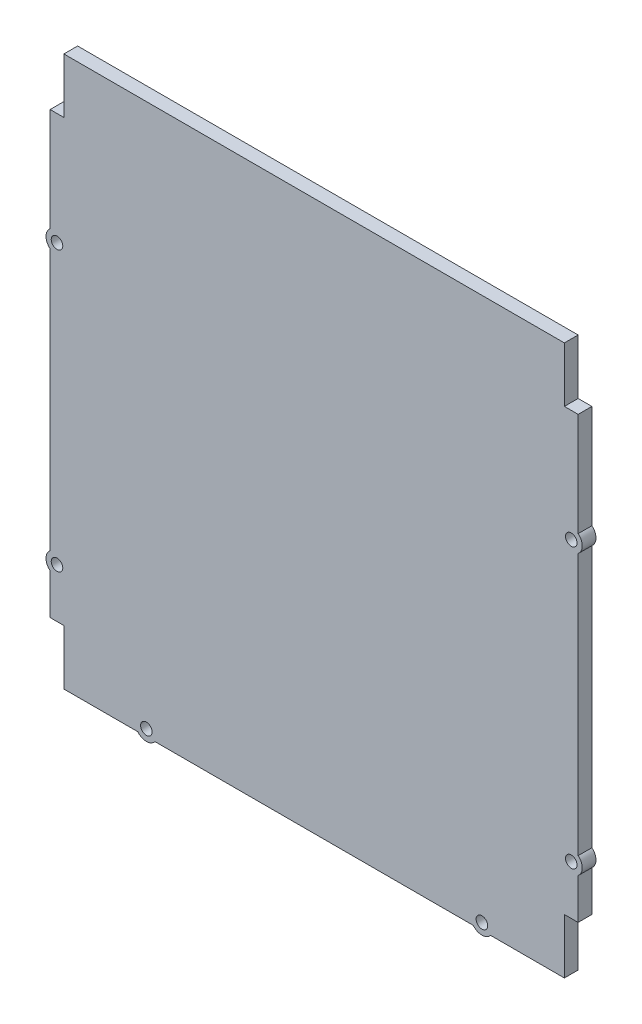
ISO-10303-21;
HEADER;
FILE_DESCRIPTION(('STEP AP214'),'2;1');
FILE_NAME('part.step','',(''),(''),'','','');
FILE_SCHEMA(('AUTOMOTIVE_DESIGN { 1 0 10303 214 1 1 1 1 }'));
ENDSEC;
DATA;
#1=APPLICATION_CONTEXT('core data for automotive mechanical design processes');
#2=APPLICATION_PROTOCOL_DEFINITION('international standard','automotive_design',2000,#1);
#3=PRODUCT_CONTEXT('',#1,'mechanical');
#4=PRODUCT('Part','Part','',(#3));
#5=PRODUCT_RELATED_PRODUCT_CATEGORY('part','',(#4));
#6=PRODUCT_DEFINITION_FORMATION('','',#4);
#7=PRODUCT_DEFINITION_CONTEXT('part definition',#1,'design');
#8=PRODUCT_DEFINITION('design','',#6,#7);
#9=PRODUCT_DEFINITION_SHAPE('','',#8);
#10=(LENGTH_UNIT() NAMED_UNIT(*) SI_UNIT(.MILLI.,.METRE.));
#11=(NAMED_UNIT(*) PLANE_ANGLE_UNIT() SI_UNIT($,.RADIAN.));
#12=(NAMED_UNIT(*) SI_UNIT($,.STERADIAN.) SOLID_ANGLE_UNIT());
#13=UNCERTAINTY_MEASURE_WITH_UNIT(LENGTH_MEASURE(1.E-05),#10,'distance_accuracy_value','');
#14=(GEOMETRIC_REPRESENTATION_CONTEXT(3) GLOBAL_UNCERTAINTY_ASSIGNED_CONTEXT((#13)) GLOBAL_UNIT_ASSIGNED_CONTEXT((#10,
#11,#12)) REPRESENTATION_CONTEXT('',''));
#15=CARTESIAN_POINT('',(0.,0.,0.));
#16=DIRECTION('',(0.,0.,1.));
#17=DIRECTION('',(1.,0.,0.));
#18=AXIS2_PLACEMENT_3D('',#15,#16,#17);
#19=CARTESIAN_POINT('',(-182.,0.,5.));
#20=DIRECTION('',(0.,1.,0.));
#21=DIRECTION('',(0.,0.,1.));
#22=AXIS2_PLACEMENT_3D('',#19,#20,#21);
#23=PLANE('',#22);
#24=DIRECTION('',(1.,0.,0.));
#25=VECTOR('',#24,1.);
#26=CARTESIAN_POINT('',(-182.,0.,5.));
#27=LINE('',#26,#25);
#28=CARTESIAN_POINT('',(-26.8775010008008,0.,5.));
#29=VERTEX_POINT('',#28);
#30=CARTESIAN_POINT('',(0.,0.,5.));
#31=VERTEX_POINT('',#30);
#32=EDGE_CURVE('E52',#29,#31,#27,.T.);
#33=ORIENTED_EDGE('',*,*,#32,.F.);
#34=DIRECTION('',(0.,0.,-1.));
#35=VECTOR('',#34,1.);
#36=CARTESIAN_POINT('',(-26.8775010008008,0.,5.));
#37=LINE('',#36,#35);
#38=CARTESIAN_POINT('',(-26.8775010008008,0.,0.));
#39=VERTEX_POINT('',#38);
#40=EDGE_CURVE('E211',#29,#39,#37,.T.);
#41=ORIENTED_EDGE('',*,*,#40,.T.);
#42=DIRECTION('',(1.,0.,0.));
#43=VECTOR('',#42,1.);
#44=CARTESIAN_POINT('',(-182.,0.,0.));
#45=LINE('',#44,#43);
#46=CARTESIAN_POINT('',(0.,0.,0.));
#47=VERTEX_POINT('',#46);
#48=EDGE_CURVE('E199',#39,#47,#45,.T.);
#49=ORIENTED_EDGE('',*,*,#48,.T.);
#50=DIRECTION('',(0.,0.,-1.));
#51=VECTOR('',#50,1.);
#52=CARTESIAN_POINT('',(0.,0.,5.));
#53=LINE('',#52,#51);
#54=EDGE_CURVE('E391',#31,#47,#53,.T.);
#55=ORIENTED_EDGE('',*,*,#54,.F.);
#56=EDGE_LOOP('',(#33,#41,#49,#55));
#57=FACE_BOUND('',#56,.T.);
#58=ADVANCED_FACE('F37',(#57),#23,.F.);
#59=CARTESIAN_POINT('',(-148.877501000801,0.,0.));
#60=VERTEX_POINT('',#59);
#61=CARTESIAN_POINT('',(-33.1224989991992,0.,0.));
#62=VERTEX_POINT('',#61);
#63=EDGE_CURVE('E207',#60,#62,#45,.T.);
#64=ORIENTED_EDGE('',*,*,#63,.T.);
#65=DIRECTION('',(0.,0.,-1.));
#66=VECTOR('',#65,1.);
#67=CARTESIAN_POINT('',(-33.1224989991992,0.,5.));
#68=LINE('',#67,#66);
#69=CARTESIAN_POINT('',(-33.1224989991992,0.,5.));
#70=VERTEX_POINT('',#69);
#71=EDGE_CURVE('E60',#70,#62,#68,.T.);
#72=ORIENTED_EDGE('',*,*,#71,.F.);
#73=CARTESIAN_POINT('',(-148.877501000801,0.,5.));
#74=VERTEX_POINT('',#73);
#75=EDGE_CURVE('E340',#74,#70,#27,.T.);
#76=ORIENTED_EDGE('',*,*,#75,.F.);
#77=DIRECTION('',(0.,0.,-1.));
#78=VECTOR('',#77,1.);
#79=CARTESIAN_POINT('',(-148.877501000801,0.,5.));
#80=LINE('',#79,#78);
#81=EDGE_CURVE('E229',#74,#60,#80,.T.);
#82=ORIENTED_EDGE('',*,*,#81,.T.);
#83=EDGE_LOOP('',(#64,#72,#76,#82));
#84=FACE_BOUND('',#83,.T.);
#85=ADVANCED_FACE('F469',(#84),#23,.F.);
#86=CARTESIAN_POINT('',(-187.,180.,5.));
#87=DIRECTION('',(1.,0.,0.));
#88=DIRECTION('',(0.,1.,0.));
#89=AXIS2_PLACEMENT_3D('',#86,#87,#88);
#90=PLANE('',#89);
#91=DIRECTION('',(0.,0.,-1.));
#92=VECTOR('',#91,1.);
#93=CARTESIAN_POINT('',(-187.,34.7775010008008,5.));
#94=LINE('',#93,#92);
#95=CARTESIAN_POINT('',(-187.,34.7775010008008,5.));
#96=VERTEX_POINT('',#95);
#97=CARTESIAN_POINT('',(-187.,34.7775010008008,0.));
#98=VERTEX_POINT('',#97);
#99=EDGE_CURVE('E253',#96,#98,#94,.T.);
#100=ORIENTED_EDGE('',*,*,#99,.T.);
#101=DIRECTION('',(0.,-1.,0.));
#102=VECTOR('',#101,1.);
#103=CARTESIAN_POINT('',(-187.,180.,0.));
#104=LINE('',#103,#102);
#105=CARTESIAN_POINT('',(-187.,20.,0.));
#106=VERTEX_POINT('',#105);
#107=EDGE_CURVE('E360',#98,#106,#104,.T.);
#108=ORIENTED_EDGE('',*,*,#107,.T.);
#109=DIRECTION('',(0.,0.,-1.));
#110=VECTOR('',#109,1.);
#111=CARTESIAN_POINT('',(-187.,20.,5.));
#112=LINE('',#111,#110);
#113=CARTESIAN_POINT('',(-187.,20.,5.));
#114=VERTEX_POINT('',#113);
#115=EDGE_CURVE('E399',#114,#106,#112,.T.);
#116=ORIENTED_EDGE('',*,*,#115,.F.);
#117=DIRECTION('',(0.,-1.,0.));
#118=VECTOR('',#117,1.);
#119=CARTESIAN_POINT('',(-187.,180.,5.));
#120=LINE('',#119,#118);
#121=EDGE_CURVE('E327',#96,#114,#120,.T.);
#122=ORIENTED_EDGE('',*,*,#121,.F.);
#123=EDGE_LOOP('',(#100,#108,#116,#122));
#124=FACE_BOUND('',#123,.T.);
#125=ADVANCED_FACE('F491',(#124),#90,.F.);
#126=DIRECTION('',(0.,0.,-1.));
#127=VECTOR('',#126,1.);
#128=CARTESIAN_POINT('',(-187.,41.0224989991992,5.));
#129=LINE('',#128,#127);
#130=CARTESIAN_POINT('',(-187.,41.0224989991992,5.));
#131=VERTEX_POINT('',#130);
#132=CARTESIAN_POINT('',(-187.,41.0224989991992,0.));
#133=VERTEX_POINT('',#132);
#134=EDGE_CURVE('E250',#131,#133,#129,.T.);
#135=ORIENTED_EDGE('',*,*,#134,.F.);
#136=CARTESIAN_POINT('',(-187.,136.177501000801,5.));
#137=VERTEX_POINT('',#136);
#138=EDGE_CURVE('E332',#137,#131,#120,.T.);
#139=ORIENTED_EDGE('',*,*,#138,.F.);
#140=DIRECTION('',(0.,0.,-1.));
#141=VECTOR('',#140,1.);
#142=CARTESIAN_POINT('',(-187.,136.177501000801,5.));
#143=LINE('',#142,#141);
#144=CARTESIAN_POINT('',(-187.,136.177501000801,0.));
#145=VERTEX_POINT('',#144);
#146=EDGE_CURVE('E265',#137,#145,#143,.T.);
#147=ORIENTED_EDGE('',*,*,#146,.T.);
#148=EDGE_CURVE('E364',#145,#133,#104,.T.);
#149=ORIENTED_EDGE('',*,*,#148,.T.);
#150=EDGE_LOOP('',(#135,#139,#147,#149));
#151=FACE_BOUND('',#150,.T.);
#152=ADVANCED_FACE('F495',(#151),#90,.F.);
#153=DIRECTION('',(0.,0.,-1.));
#154=VECTOR('',#153,1.);
#155=CARTESIAN_POINT('',(-187.,142.422498999199,5.));
#156=LINE('',#155,#154);
#157=CARTESIAN_POINT('',(-187.,142.422498999199,5.));
#158=VERTEX_POINT('',#157);
#159=CARTESIAN_POINT('',(-187.,142.422498999199,0.));
#160=VERTEX_POINT('',#159);
#161=EDGE_CURVE('E262',#158,#160,#156,.T.);
#162=ORIENTED_EDGE('',*,*,#161,.F.);
#163=CARTESIAN_POINT('',(-187.,180.,5.));
#164=VERTEX_POINT('',#163);
#165=EDGE_CURVE('E328',#164,#158,#120,.T.);
#166=ORIENTED_EDGE('',*,*,#165,.F.);
#167=DIRECTION('',(0.,0.,-1.));
#168=VECTOR('',#167,1.);
#169=CARTESIAN_POINT('',(-187.,180.,5.));
#170=LINE('',#169,#168);
#171=CARTESIAN_POINT('',(-187.,180.,0.));
#172=VERTEX_POINT('',#171);
#173=EDGE_CURVE('E402',#164,#172,#170,.T.);
#174=ORIENTED_EDGE('',*,*,#173,.T.);
#175=EDGE_CURVE('E361',#172,#160,#104,.T.);
#176=ORIENTED_EDGE('',*,*,#175,.T.);
#177=EDGE_LOOP('',(#162,#166,#174,#176));
#178=FACE_BOUND('',#177,.T.);
#179=ADVANCED_FACE('F415',(#178),#90,.F.);
#180=CARTESIAN_POINT('',(5.,20.,5.));
#181=DIRECTION('',(-1.,0.,0.));
#182=DIRECTION('',(0.,-1.,0.));
#183=AXIS2_PLACEMENT_3D('',#180,#181,#182);
#184=PLANE('',#183);
#185=DIRECTION('',(0.,1.,0.));
#186=VECTOR('',#185,1.);
#187=CARTESIAN_POINT('',(5.,20.,5.));
#188=LINE('',#187,#186);
#189=CARTESIAN_POINT('',(5.,41.0224989991992,5.));
#190=VERTEX_POINT('',#189);
#191=CARTESIAN_POINT('',(4.99999999999999,136.177501000801,5.));
#192=VERTEX_POINT('',#191);
#193=EDGE_CURVE('E349',#190,#192,#188,.T.);
#194=ORIENTED_EDGE('',*,*,#193,.F.);
#195=DIRECTION('',(0.,0.,-1.));
#196=VECTOR('',#195,1.);
#197=CARTESIAN_POINT('',(5.,41.0224989991992,5.));
#198=LINE('',#197,#196);
#199=CARTESIAN_POINT('',(5.,41.0224989991992,0.));
#200=VERTEX_POINT('',#199);
#201=EDGE_CURVE('E277',#190,#200,#198,.T.);
#202=ORIENTED_EDGE('',*,*,#201,.T.);
#203=DIRECTION('',(0.,1.,0.));
#204=VECTOR('',#203,1.);
#205=CARTESIAN_POINT('',(5.,20.,0.));
#206=LINE('',#205,#204);
#207=CARTESIAN_POINT('',(4.99999999999999,136.177501000801,0.));
#208=VERTEX_POINT('',#207);
#209=EDGE_CURVE('E374',#200,#208,#206,.T.);
#210=ORIENTED_EDGE('',*,*,#209,.T.);
#211=DIRECTION('',(0.,0.,-1.));
#212=VECTOR('',#211,1.);
#213=CARTESIAN_POINT('',(4.99999999999999,136.177501000801,5.));
#214=LINE('',#213,#212);
#215=EDGE_CURVE('E286',#192,#208,#214,.T.);
#216=ORIENTED_EDGE('',*,*,#215,.F.);
#217=EDGE_LOOP('',(#194,#202,#210,#216));
#218=FACE_BOUND('',#217,.T.);
#219=ADVANCED_FACE('F446',(#218),#184,.F.);
#220=CARTESIAN_POINT('',(4.99999999999999,142.422498999199,5.));
#221=VERTEX_POINT('',#220);
#222=CARTESIAN_POINT('',(4.99999999999999,180.,5.));
#223=VERTEX_POINT('',#222);
#224=EDGE_CURVE('E344',#221,#223,#188,.T.);
#225=ORIENTED_EDGE('',*,*,#224,.F.);
#226=DIRECTION('',(0.,0.,-1.));
#227=VECTOR('',#226,1.);
#228=CARTESIAN_POINT('',(4.99999999999999,142.422498999199,5.));
#229=LINE('',#228,#227);
#230=CARTESIAN_POINT('',(4.99999999999999,142.422498999199,0.));
#231=VERTEX_POINT('',#230);
#232=EDGE_CURVE('E289',#221,#231,#229,.T.);
#233=ORIENTED_EDGE('',*,*,#232,.T.);
#234=CARTESIAN_POINT('',(4.99999999999999,180.,0.));
#235=VERTEX_POINT('',#234);
#236=EDGE_CURVE('E370',#231,#235,#206,.T.);
#237=ORIENTED_EDGE('',*,*,#236,.T.);
#238=DIRECTION('',(0.,0.,-1.));
#239=VECTOR('',#238,1.);
#240=CARTESIAN_POINT('',(4.99999999999999,180.,5.));
#241=LINE('',#240,#239);
#242=EDGE_CURVE('E382',#223,#235,#241,.T.);
#243=ORIENTED_EDGE('',*,*,#242,.F.);
#244=EDGE_LOOP('',(#225,#233,#237,#243));
#245=FACE_BOUND('',#244,.T.);
#246=ADVANCED_FACE('F441',(#245),#184,.F.);
#247=CARTESIAN_POINT('',(0.,200.,5.));
#248=DIRECTION('',(0.,-1.,0.));
#249=DIRECTION('',(1.,0.,0.));
#250=AXIS2_PLACEMENT_3D('',#247,#248,#249);
#251=PLANE('',#250);
#252=DIRECTION('',(-1.,0.,0.));
#253=VECTOR('',#252,1.);
#254=CARTESIAN_POINT('',(0.,200.,0.));
#255=LINE('',#254,#253);
#256=CARTESIAN_POINT('',(0.,200.,0.));
#257=VERTEX_POINT('',#256);
#258=CARTESIAN_POINT('',(-182.,200.,0.));
#259=VERTEX_POINT('',#258);
#260=EDGE_CURVE('E318',#257,#259,#255,.T.);
#261=ORIENTED_EDGE('',*,*,#260,.T.);
#262=DIRECTION('',(0.,0.,-1.));
#263=VECTOR('',#262,1.);
#264=CARTESIAN_POINT('',(-182.,200.,5.));
#265=LINE('',#264,#263);
#266=CARTESIAN_POINT('',(-182.,200.,5.));
#267=VERTEX_POINT('',#266);
#268=EDGE_CURVE('E11',#267,#259,#265,.T.);
#269=ORIENTED_EDGE('',*,*,#268,.F.);
#270=DIRECTION('',(-1.,0.,0.));
#271=VECTOR('',#270,1.);
#272=CARTESIAN_POINT('',(0.,200.,5.));
#273=LINE('',#272,#271);
#274=CARTESIAN_POINT('',(0.,200.,5.));
#275=VERTEX_POINT('',#274);
#276=EDGE_CURVE('E319',#275,#267,#273,.T.);
#277=ORIENTED_EDGE('',*,*,#276,.F.);
#278=DIRECTION('',(0.,0.,-1.));
#279=VECTOR('',#278,1.);
#280=CARTESIAN_POINT('',(0.,200.,5.));
#281=LINE('',#280,#279);
#282=EDGE_CURVE('E353',#275,#257,#281,.T.);
#283=ORIENTED_EDGE('',*,*,#282,.T.);
#284=EDGE_LOOP('',(#261,#269,#277,#283));
#285=FACE_BOUND('',#284,.T.);
#286=ADVANCED_FACE('F39',(#285),#251,.F.);
#287=CARTESIAN_POINT('',(-182.,200.,5.));
#288=DIRECTION('',(1.,0.,0.));
#289=DIRECTION('',(0.,0.,-1.));
#290=AXIS2_PLACEMENT_3D('',#287,#288,#289);
#291=PLANE('',#290);
#292=DIRECTION('',(0.,-1.,0.));
#293=VECTOR('',#292,1.);
#294=CARTESIAN_POINT('',(-182.,200.,0.));
#295=LINE('',#294,#293);
#296=CARTESIAN_POINT('',(-182.,180.,0.));
#297=VERTEX_POINT('',#296);
#298=EDGE_CURVE('E356',#259,#297,#295,.T.);
#299=ORIENTED_EDGE('',*,*,#298,.T.);
#300=DIRECTION('',(0.,0.,-1.));
#301=VECTOR('',#300,1.);
#302=CARTESIAN_POINT('',(-182.,180.,5.));
#303=LINE('',#302,#301);
#304=CARTESIAN_POINT('',(-182.,180.,5.));
#305=VERTEX_POINT('',#304);
#306=EDGE_CURVE('E45',#305,#297,#303,.T.);
#307=ORIENTED_EDGE('',*,*,#306,.F.);
#308=DIRECTION('',(0.,-1.,0.));
#309=VECTOR('',#308,1.);
#310=CARTESIAN_POINT('',(-182.,200.,5.));
#311=LINE('',#310,#309);
#312=EDGE_CURVE('E322',#267,#305,#311,.T.);
#313=ORIENTED_EDGE('',*,*,#312,.F.);
#314=ORIENTED_EDGE('',*,*,#268,.T.);
#315=EDGE_LOOP('',(#299,#307,#313,#314));
#316=FACE_BOUND('',#315,.T.);
#317=ADVANCED_FACE('F427',(#316),#291,.F.);
#318=CARTESIAN_POINT('',(-182.,180.,5.));
#319=DIRECTION('',(0.,-1.,0.));
#320=DIRECTION('',(0.,0.,-1.));
#321=AXIS2_PLACEMENT_3D('',#318,#319,#320);
#322=PLANE('',#321);
#323=DIRECTION('',(-1.,0.,0.));
#324=VECTOR('',#323,1.);
#325=CARTESIAN_POINT('',(-182.,180.,0.));
#326=LINE('',#325,#324);
#327=EDGE_CURVE('E358',#297,#172,#326,.T.);
#328=ORIENTED_EDGE('',*,*,#327,.T.);
#329=ORIENTED_EDGE('',*,*,#173,.F.);
#330=DIRECTION('',(-1.,0.,0.));
#331=VECTOR('',#330,1.);
#332=CARTESIAN_POINT('',(-182.,180.,5.));
#333=LINE('',#332,#331);
#334=EDGE_CURVE('E325',#305,#164,#333,.T.);
#335=ORIENTED_EDGE('',*,*,#334,.F.);
#336=ORIENTED_EDGE('',*,*,#306,.T.);
#337=EDGE_LOOP('',(#328,#329,#335,#336));
#338=FACE_BOUND('',#337,.T.);
#339=ADVANCED_FACE('F409',(#338),#322,.F.);
#340=CARTESIAN_POINT('',(-187.,20.,5.));
#341=DIRECTION('',(0.,1.,0.));
#342=DIRECTION('',(0.,0.,1.));
#343=AXIS2_PLACEMENT_3D('',#340,#341,#342);
#344=PLANE('',#343);
#345=DIRECTION('',(1.,0.,0.));
#346=VECTOR('',#345,1.);
#347=CARTESIAN_POINT('',(-187.,20.,0.));
#348=LINE('',#347,#346);
#349=CARTESIAN_POINT('',(-182.,20.,0.));
#350=VERTEX_POINT('',#349);
#351=EDGE_CURVE('E363',#106,#350,#348,.T.);
#352=ORIENTED_EDGE('',*,*,#351,.T.);
#353=DIRECTION('',(0.,0.,-1.));
#354=VECTOR('',#353,1.);
#355=CARTESIAN_POINT('',(-182.,20.,5.));
#356=LINE('',#355,#354);
#357=CARTESIAN_POINT('',(-182.,20.,5.));
#358=VERTEX_POINT('',#357);
#359=EDGE_CURVE('E396',#358,#350,#356,.T.);
#360=ORIENTED_EDGE('',*,*,#359,.F.);
#361=DIRECTION('',(1.,0.,0.));
#362=VECTOR('',#361,1.);
#363=CARTESIAN_POINT('',(-187.,20.,5.));
#364=LINE('',#363,#362);
#365=EDGE_CURVE('E331',#114,#358,#364,.T.);
#366=ORIENTED_EDGE('',*,*,#365,.F.);
#367=ORIENTED_EDGE('',*,*,#115,.T.);
#368=EDGE_LOOP('',(#352,#360,#366,#367));
#369=FACE_BOUND('',#368,.T.);
#370=ADVANCED_FACE('F486',(#369),#344,.F.);
#371=CARTESIAN_POINT('',(-182.,20.,5.));
#372=DIRECTION('',(1.,0.,0.));
#373=DIRECTION('',(0.,1.,0.));
#374=AXIS2_PLACEMENT_3D('',#371,#372,#373);
#375=PLANE('',#374);
#376=DIRECTION('',(0.,-1.,0.));
#377=VECTOR('',#376,1.);
#378=CARTESIAN_POINT('',(-182.,20.,0.));
#379=LINE('',#378,#377);
#380=CARTESIAN_POINT('',(-182.,0.,0.));
#381=VERTEX_POINT('',#380);
#382=EDGE_CURVE('E208',#350,#381,#379,.T.);
#383=ORIENTED_EDGE('',*,*,#382,.T.);
#384=DIRECTION('',(0.,0.,-1.));
#385=VECTOR('',#384,1.);
#386=CARTESIAN_POINT('',(-182.,0.,5.));
#387=LINE('',#386,#385);
#388=CARTESIAN_POINT('',(-182.,0.,5.));
#389=VERTEX_POINT('',#388);
#390=EDGE_CURVE('E393',#389,#381,#387,.T.);
#391=ORIENTED_EDGE('',*,*,#390,.F.);
#392=DIRECTION('',(0.,-1.,0.));
#393=VECTOR('',#392,1.);
#394=CARTESIAN_POINT('',(-182.,20.,5.));
#395=LINE('',#394,#393);
#396=EDGE_CURVE('E334',#358,#389,#395,.T.);
#397=ORIENTED_EDGE('',*,*,#396,.F.);
#398=ORIENTED_EDGE('',*,*,#359,.T.);
#399=EDGE_LOOP('',(#383,#391,#397,#398));
#400=FACE_BOUND('',#399,.T.);
#401=ADVANCED_FACE('F482',(#400),#375,.F.);
#402=CARTESIAN_POINT('',(-155.122498999199,0.,0.));
#403=VERTEX_POINT('',#402);
#404=EDGE_CURVE('E210',#381,#403,#45,.T.);
#405=ORIENTED_EDGE('',*,*,#404,.T.);
#406=DIRECTION('',(0.,0.,-1.));
#407=VECTOR('',#406,1.);
#408=CARTESIAN_POINT('',(-155.122498999199,0.,5.));
#409=LINE('',#408,#407);
#410=CARTESIAN_POINT('',(-155.122498999199,0.,5.));
#411=VERTEX_POINT('',#410);
#412=EDGE_CURVE('E226',#411,#403,#409,.T.);
#413=ORIENTED_EDGE('',*,*,#412,.F.);
#414=EDGE_CURVE('E336',#389,#411,#27,.T.);
#415=ORIENTED_EDGE('',*,*,#414,.F.);
#416=ORIENTED_EDGE('',*,*,#390,.T.);
#417=EDGE_LOOP('',(#405,#413,#415,#416));
#418=FACE_BOUND('',#417,.T.);
#419=ADVANCED_FACE('F477',(#418),#23,.F.);
#420=CARTESIAN_POINT('',(0.,0.,5.));
#421=DIRECTION('',(-1.,0.,0.));
#422=DIRECTION('',(0.,0.,1.));
#423=AXIS2_PLACEMENT_3D('',#420,#421,#422);
#424=PLANE('',#423);
#425=DIRECTION('',(0.,1.,0.));
#426=VECTOR('',#425,1.);
#427=CARTESIAN_POINT('',(0.,0.,0.));
#428=LINE('',#427,#426);
#429=CARTESIAN_POINT('',(0.,20.,0.));
#430=VERTEX_POINT('',#429);
#431=EDGE_CURVE('E205',#47,#430,#428,.T.);
#432=ORIENTED_EDGE('',*,*,#431,.T.);
#433=DIRECTION('',(0.,0.,-1.));
#434=VECTOR('',#433,1.);
#435=CARTESIAN_POINT('',(0.,20.,5.));
#436=LINE('',#435,#434);
#437=CARTESIAN_POINT('',(0.,20.,5.));
#438=VERTEX_POINT('',#437);
#439=EDGE_CURVE('E388',#438,#430,#436,.T.);
#440=ORIENTED_EDGE('',*,*,#439,.F.);
#441=DIRECTION('',(0.,1.,0.));
#442=VECTOR('',#441,1.);
#443=CARTESIAN_POINT('',(0.,0.,5.));
#444=LINE('',#443,#442);
#445=EDGE_CURVE('E339',#31,#438,#444,.T.);
#446=ORIENTED_EDGE('',*,*,#445,.F.);
#447=ORIENTED_EDGE('',*,*,#54,.T.);
#448=EDGE_LOOP('',(#432,#440,#446,#447));
#449=FACE_BOUND('',#448,.T.);
#450=ADVANCED_FACE('F466',(#449),#424,.F.);
#451=CARTESIAN_POINT('',(0.,20.,5.));
#452=DIRECTION('',(0.,1.,0.));
#453=DIRECTION('',(0.,0.,1.));
#454=AXIS2_PLACEMENT_3D('',#451,#452,#453);
#455=PLANE('',#454);
#456=DIRECTION('',(1.,0.,0.));
#457=VECTOR('',#456,1.);
#458=CARTESIAN_POINT('',(0.,20.,0.));
#459=LINE('',#458,#457);
#460=CARTESIAN_POINT('',(5.,20.,0.));
#461=VERTEX_POINT('',#460);
#462=EDGE_CURVE('E368',#430,#461,#459,.T.);
#463=ORIENTED_EDGE('',*,*,#462,.T.);
#464=DIRECTION('',(0.,0.,-1.));
#465=VECTOR('',#464,1.);
#466=CARTESIAN_POINT('',(5.,20.,5.));
#467=LINE('',#466,#465);
#468=CARTESIAN_POINT('',(5.,20.,5.));
#469=VERTEX_POINT('',#468);
#470=EDGE_CURVE('E385',#469,#461,#467,.T.);
#471=ORIENTED_EDGE('',*,*,#470,.F.);
#472=DIRECTION('',(1.,0.,0.));
#473=VECTOR('',#472,1.);
#474=CARTESIAN_POINT('',(0.,20.,5.));
#475=LINE('',#474,#473);
#476=EDGE_CURVE('E342',#438,#469,#475,.T.);
#477=ORIENTED_EDGE('',*,*,#476,.F.);
#478=ORIENTED_EDGE('',*,*,#439,.T.);
#479=EDGE_LOOP('',(#463,#471,#477,#478));
#480=FACE_BOUND('',#479,.T.);
#481=ADVANCED_FACE('F462',(#480),#455,.F.);
#482=CARTESIAN_POINT('',(5.,34.7775010008008,0.));
#483=VERTEX_POINT('',#482);
#484=EDGE_CURVE('E371',#461,#483,#206,.T.);
#485=ORIENTED_EDGE('',*,*,#484,.T.);
#486=DIRECTION('',(0.,0.,-1.));
#487=VECTOR('',#486,1.);
#488=CARTESIAN_POINT('',(5.,34.7775010008008,5.));
#489=LINE('',#488,#487);
#490=CARTESIAN_POINT('',(5.,34.7775010008008,5.));
#491=VERTEX_POINT('',#490);
#492=EDGE_CURVE('E274',#491,#483,#489,.T.);
#493=ORIENTED_EDGE('',*,*,#492,.F.);
#494=EDGE_CURVE('E345',#469,#491,#188,.T.);
#495=ORIENTED_EDGE('',*,*,#494,.F.);
#496=ORIENTED_EDGE('',*,*,#470,.T.);
#497=EDGE_LOOP('',(#485,#493,#495,#496));
#498=FACE_BOUND('',#497,.T.);
#499=ADVANCED_FACE('F457',(#498),#184,.F.);
#500=CARTESIAN_POINT('',(4.99999999999999,180.,5.));
#501=DIRECTION('',(0.,-1.,0.));
#502=DIRECTION('',(0.,0.,-1.));
#503=AXIS2_PLACEMENT_3D('',#500,#501,#502);
#504=PLANE('',#503);
#505=DIRECTION('',(-1.,0.,0.));
#506=VECTOR('',#505,1.);
#507=CARTESIAN_POINT('',(4.99999999999999,180.,0.));
#508=LINE('',#507,#506);
#509=CARTESIAN_POINT('',(0.,180.,0.));
#510=VERTEX_POINT('',#509);
#511=EDGE_CURVE('E373',#235,#510,#508,.T.);
#512=ORIENTED_EDGE('',*,*,#511,.T.);
#513=DIRECTION('',(0.,0.,-1.));
#514=VECTOR('',#513,1.);
#515=CARTESIAN_POINT('',(0.,180.,5.));
#516=LINE('',#515,#514);
#517=CARTESIAN_POINT('',(0.,180.,5.));
#518=VERTEX_POINT('',#517);
#519=EDGE_CURVE('E379',#518,#510,#516,.T.);
#520=ORIENTED_EDGE('',*,*,#519,.F.);
#521=DIRECTION('',(-1.,0.,0.));
#522=VECTOR('',#521,1.);
#523=CARTESIAN_POINT('',(4.99999999999999,180.,5.));
#524=LINE('',#523,#522);
#525=EDGE_CURVE('E348',#223,#518,#524,.T.);
#526=ORIENTED_EDGE('',*,*,#525,.F.);
#527=ORIENTED_EDGE('',*,*,#242,.T.);
#528=EDGE_LOOP('',(#512,#520,#526,#527));
#529=FACE_BOUND('',#528,.T.);
#530=ADVANCED_FACE('F438',(#529),#504,.F.);
#531=CARTESIAN_POINT('',(0.,180.,5.));
#532=DIRECTION('',(-1.,0.,0.));
#533=DIRECTION('',(0.,0.,1.));
#534=AXIS2_PLACEMENT_3D('',#531,#532,#533);
#535=PLANE('',#534);
#536=DIRECTION('',(0.,1.,0.));
#537=VECTOR('',#536,1.);
#538=CARTESIAN_POINT('',(0.,180.,0.));
#539=LINE('',#538,#537);
#540=EDGE_CURVE('E323',#510,#257,#539,.T.);
#541=ORIENTED_EDGE('',*,*,#540,.T.);
#542=ORIENTED_EDGE('',*,*,#282,.F.);
#543=DIRECTION('',(0.,1.,0.));
#544=VECTOR('',#543,1.);
#545=CARTESIAN_POINT('',(0.,180.,5.));
#546=LINE('',#545,#544);
#547=EDGE_CURVE('E351',#518,#275,#546,.T.);
#548=ORIENTED_EDGE('',*,*,#547,.F.);
#549=ORIENTED_EDGE('',*,*,#519,.T.);
#550=EDGE_LOOP('',(#541,#542,#548,#549));
#551=FACE_BOUND('',#550,.T.);
#552=ADVANCED_FACE('F433',(#551),#535,.F.);
#553=CARTESIAN_POINT('',(0.,0.,5.));
#554=DIRECTION('',(0.,0.,1.));
#555=DIRECTION('',(1.,0.,0.));
#556=AXIS2_PLACEMENT_3D('',#553,#554,#555);
#557=PLANE('',#556);
#558=CARTESIAN_POINT('',(-30.,2.5,5.));
#559=DIRECTION('',(0.,0.,-1.));
#560=DIRECTION('',(-1.,0.,0.));
#561=AXIS2_PLACEMENT_3D('',#558,#559,#560);
#562=CIRCLE('',#561,2.1);
#563=CARTESIAN_POINT('',(-32.1,2.5,5.));
#564=VERTEX_POINT('',#563);
#565=EDGE_CURVE('E235',#564,#564,#562,.T.);
#566=ORIENTED_EDGE('',*,*,#565,.T.);
#567=EDGE_LOOP('',(#566));
#568=FACE_BOUND('',#567,.T.);
#569=CARTESIAN_POINT('',(-152.,2.5,5.));
#570=DIRECTION('',(0.,0.,-1.));
#571=DIRECTION('',(-1.,0.,0.));
#572=AXIS2_PLACEMENT_3D('',#569,#570,#571);
#573=CIRCLE('',#572,2.09999999999999);
#574=CARTESIAN_POINT('',(-154.1,2.5,5.));
#575=VERTEX_POINT('',#574);
#576=EDGE_CURVE('E242',#575,#575,#573,.T.);
#577=ORIENTED_EDGE('',*,*,#576,.T.);
#578=EDGE_LOOP('',(#577));
#579=FACE_BOUND('',#578,.T.);
#580=CARTESIAN_POINT('',(-184.5,139.3,5.));
#581=DIRECTION('',(0.,0.,1.));
#582=DIRECTION('',(1.,0.,0.));
#583=AXIS2_PLACEMENT_3D('',#580,#581,#582);
#584=CIRCLE('',#583,2.09999999999999);
#585=CARTESIAN_POINT('',(-182.4,139.3,5.));
#586=VERTEX_POINT('',#585);
#587=EDGE_CURVE('E315',#586,#586,#584,.T.);
#588=ORIENTED_EDGE('',*,*,#587,.F.);
#589=EDGE_LOOP('',(#588));
#590=FACE_BOUND('',#589,.T.);
#591=CARTESIAN_POINT('',(-184.5,37.9,5.));
#592=DIRECTION('',(0.,0.,1.));
#593=DIRECTION('',(1.,0.,0.));
#594=AXIS2_PLACEMENT_3D('',#591,#592,#593);
#595=CIRCLE('',#594,2.10000000000002);
#596=CARTESIAN_POINT('',(-182.4,37.9,5.));
#597=VERTEX_POINT('',#596);
#598=EDGE_CURVE('E312',#597,#597,#595,.T.);
#599=ORIENTED_EDGE('',*,*,#598,.F.);
#600=EDGE_LOOP('',(#599));
#601=FACE_BOUND('',#600,.T.);
#602=CARTESIAN_POINT('',(2.5,37.9,5.));
#603=DIRECTION('',(0.,0.,1.));
#604=DIRECTION('',(1.,0.,0.));
#605=AXIS2_PLACEMENT_3D('',#602,#603,#604);
#606=CIRCLE('',#605,2.1);
#607=CARTESIAN_POINT('',(4.6,37.9,5.));
#608=VERTEX_POINT('',#607);
#609=EDGE_CURVE('E309',#608,#608,#606,.T.);
#610=ORIENTED_EDGE('',*,*,#609,.F.);
#611=EDGE_LOOP('',(#610));
#612=FACE_BOUND('',#611,.T.);
#613=CARTESIAN_POINT('',(2.5,139.3,5.));
#614=DIRECTION('',(0.,0.,1.));
#615=DIRECTION('',(1.,0.,0.));
#616=AXIS2_PLACEMENT_3D('',#613,#614,#615);
#617=CIRCLE('',#616,2.09999999999999);
#618=CARTESIAN_POINT('',(4.6,139.3,5.));
#619=VERTEX_POINT('',#618);
#620=EDGE_CURVE('E306',#619,#619,#617,.T.);
#621=ORIENTED_EDGE('',*,*,#620,.F.);
#622=EDGE_LOOP('',(#621));
#623=FACE_BOUND('',#622,.T.);
#624=ORIENTED_EDGE('',*,*,#276,.T.);
#625=ORIENTED_EDGE('',*,*,#312,.T.);
#626=ORIENTED_EDGE('',*,*,#334,.T.);
#627=ORIENTED_EDGE('',*,*,#165,.T.);
#628=CARTESIAN_POINT('',(-184.5,139.3,5.));
#629=DIRECTION('',(0.,0.,1.));
#630=DIRECTION('',(1.,0.,0.));
#631=AXIS2_PLACEMENT_3D('',#628,#629,#630);
#632=CIRCLE('',#631,3.99999999999999);
#633=EDGE_CURVE('E259',#158,#137,#632,.T.);
#634=ORIENTED_EDGE('',*,*,#633,.T.);
#635=ORIENTED_EDGE('',*,*,#138,.T.);
#636=CARTESIAN_POINT('',(-184.5,37.9,5.));
#637=DIRECTION('',(0.,0.,1.));
#638=DIRECTION('',(1.,0.,0.));
#639=AXIS2_PLACEMENT_3D('',#636,#637,#638);
#640=CIRCLE('',#639,4.);
#641=EDGE_CURVE('E247',#131,#96,#640,.T.);
#642=ORIENTED_EDGE('',*,*,#641,.T.);
#643=ORIENTED_EDGE('',*,*,#121,.T.);
#644=ORIENTED_EDGE('',*,*,#365,.T.);
#645=ORIENTED_EDGE('',*,*,#396,.T.);
#646=ORIENTED_EDGE('',*,*,#414,.T.);
#647=CARTESIAN_POINT('',(-152.,2.5,5.));
#648=DIRECTION('',(0.,0.,-1.));
#649=DIRECTION('',(-1.,0.,0.));
#650=AXIS2_PLACEMENT_3D('',#647,#648,#649);
#651=CIRCLE('',#650,4.);
#652=EDGE_CURVE('E223',#74,#411,#651,.T.);
#653=ORIENTED_EDGE('',*,*,#652,.F.);
#654=ORIENTED_EDGE('',*,*,#75,.T.);
#655=CARTESIAN_POINT('',(-30.,2.5,5.));
#656=DIRECTION('',(0.,0.,-1.));
#657=DIRECTION('',(-1.,0.,0.));
#658=AXIS2_PLACEMENT_3D('',#655,#656,#657);
#659=CIRCLE('',#658,4.00000000000001);
#660=EDGE_CURVE('E218',#29,#70,#659,.T.);
#661=ORIENTED_EDGE('',*,*,#660,.F.);
#662=ORIENTED_EDGE('',*,*,#32,.T.);
#663=ORIENTED_EDGE('',*,*,#445,.T.);
#664=ORIENTED_EDGE('',*,*,#476,.T.);
#665=ORIENTED_EDGE('',*,*,#494,.T.);
#666=CARTESIAN_POINT('',(2.5,37.9,5.));
#667=DIRECTION('',(0.,0.,-1.));
#668=DIRECTION('',(-1.,0.,0.));
#669=AXIS2_PLACEMENT_3D('',#666,#667,#668);
#670=CIRCLE('',#669,4.);
#671=EDGE_CURVE('E271',#190,#491,#670,.T.);
#672=ORIENTED_EDGE('',*,*,#671,.F.);
#673=ORIENTED_EDGE('',*,*,#193,.T.);
#674=CARTESIAN_POINT('',(2.5,139.3,5.));
#675=DIRECTION('',(0.,0.,-1.));
#676=DIRECTION('',(-1.,0.,0.));
#677=AXIS2_PLACEMENT_3D('',#674,#675,#676);
#678=CIRCLE('',#677,3.99999999999999);
#679=EDGE_CURVE('E283',#221,#192,#678,.T.);
#680=ORIENTED_EDGE('',*,*,#679,.F.);
#681=ORIENTED_EDGE('',*,*,#224,.T.);
#682=ORIENTED_EDGE('',*,*,#525,.T.);
#683=ORIENTED_EDGE('',*,*,#547,.T.);
#684=EDGE_LOOP('',(#624,#625,#626,#627,#634,#635,#642,#643,#644,#645,#646,#653,#654,#661,#662,
#663,#664,#665,#672,#673,#680,#681,#682,#683));
#685=FACE_BOUND('',#684,.T.);
#686=ADVANCED_FACE('F423',(#568,#579,#590,#601,#612,#623,#685),#557,.T.);
#687=CARTESIAN_POINT('',(0.,0.,0.));
#688=DIRECTION('',(0.,0.,1.));
#689=DIRECTION('',(1.,0.,0.));
#690=AXIS2_PLACEMENT_3D('',#687,#688,#689);
#691=PLANE('',#690);
#692=CARTESIAN_POINT('',(-30.,2.5,0.));
#693=DIRECTION('',(0.,0.,-1.));
#694=DIRECTION('',(-1.,0.,0.));
#695=AXIS2_PLACEMENT_3D('',#692,#693,#694);
#696=CIRCLE('',#695,2.1);
#697=CARTESIAN_POINT('',(-32.1,2.5,0.));
#698=VERTEX_POINT('',#697);
#699=EDGE_CURVE('E239',#698,#698,#696,.T.);
#700=ORIENTED_EDGE('',*,*,#699,.F.);
#701=EDGE_LOOP('',(#700));
#702=FACE_BOUND('',#701,.T.);
#703=CARTESIAN_POINT('',(-152.,2.5,0.));
#704=DIRECTION('',(0.,0.,-1.));
#705=DIRECTION('',(-1.,0.,0.));
#706=AXIS2_PLACEMENT_3D('',#703,#704,#705);
#707=CIRCLE('',#706,2.09999999999999);
#708=CARTESIAN_POINT('',(-154.1,2.5,0.));
#709=VERTEX_POINT('',#708);
#710=EDGE_CURVE('E232',#709,#709,#707,.T.);
#711=ORIENTED_EDGE('',*,*,#710,.F.);
#712=EDGE_LOOP('',(#711));
#713=FACE_BOUND('',#712,.T.);
#714=CARTESIAN_POINT('',(-184.5,139.3,0.));
#715=DIRECTION('',(0.,0.,-1.));
#716=DIRECTION('',(1.,0.,0.));
#717=AXIS2_PLACEMENT_3D('',#714,#715,#716);
#718=CIRCLE('',#717,2.09999999999999);
#719=CARTESIAN_POINT('',(-182.4,139.3,0.));
#720=VERTEX_POINT('',#719);
#721=EDGE_CURVE('E292',#720,#720,#718,.T.);
#722=ORIENTED_EDGE('',*,*,#721,.F.);
#723=EDGE_LOOP('',(#722));
#724=FACE_BOUND('',#723,.T.);
#725=CARTESIAN_POINT('',(-184.5,37.9,0.));
#726=DIRECTION('',(0.,0.,-1.));
#727=DIRECTION('',(1.,0.,0.));
#728=AXIS2_PLACEMENT_3D('',#725,#726,#727);
#729=CIRCLE('',#728,2.10000000000002);
#730=CARTESIAN_POINT('',(-182.4,37.9,0.));
#731=VERTEX_POINT('',#730);
#732=EDGE_CURVE('E299',#731,#731,#729,.T.);
#733=ORIENTED_EDGE('',*,*,#732,.F.);
#734=EDGE_LOOP('',(#733));
#735=FACE_BOUND('',#734,.T.);
#736=CARTESIAN_POINT('',(2.5,37.9,0.));
#737=DIRECTION('',(0.,0.,-1.));
#738=DIRECTION('',(-1.,0.,0.));
#739=AXIS2_PLACEMENT_3D('',#736,#737,#738);
#740=CIRCLE('',#739,2.1);
#741=CARTESIAN_POINT('',(0.400000000000003,37.9,0.));
#742=VERTEX_POINT('',#741);
#743=EDGE_CURVE('E295',#742,#742,#740,.T.);
#744=ORIENTED_EDGE('',*,*,#743,.F.);
#745=EDGE_LOOP('',(#744));
#746=FACE_BOUND('',#745,.T.);
#747=CARTESIAN_POINT('',(2.5,139.3,0.));
#748=DIRECTION('',(0.,0.,-1.));
#749=DIRECTION('',(-1.,0.,0.));
#750=AXIS2_PLACEMENT_3D('',#747,#748,#749);
#751=CIRCLE('',#750,2.09999999999999);
#752=CARTESIAN_POINT('',(0.400000000000011,139.3,0.));
#753=VERTEX_POINT('',#752);
#754=EDGE_CURVE('E298',#753,#753,#751,.T.);
#755=ORIENTED_EDGE('',*,*,#754,.F.);
#756=EDGE_LOOP('',(#755));
#757=FACE_BOUND('',#756,.T.);
#758=ORIENTED_EDGE('',*,*,#260,.F.);
#759=ORIENTED_EDGE('',*,*,#540,.F.);
#760=ORIENTED_EDGE('',*,*,#511,.F.);
#761=ORIENTED_EDGE('',*,*,#236,.F.);
#762=CARTESIAN_POINT('',(2.5,139.3,0.));
#763=DIRECTION('',(0.,0.,-1.));
#764=DIRECTION('',(-1.,0.,0.));
#765=AXIS2_PLACEMENT_3D('',#762,#763,#764);
#766=CIRCLE('',#765,3.99999999999999);
#767=EDGE_CURVE('E280',#231,#208,#766,.T.);
#768=ORIENTED_EDGE('',*,*,#767,.T.);
#769=ORIENTED_EDGE('',*,*,#209,.F.);
#770=CARTESIAN_POINT('',(2.5,37.9,0.));
#771=DIRECTION('',(0.,0.,-1.));
#772=DIRECTION('',(-1.,0.,0.));
#773=AXIS2_PLACEMENT_3D('',#770,#771,#772);
#774=CIRCLE('',#773,4.);
#775=EDGE_CURVE('E268',#200,#483,#774,.T.);
#776=ORIENTED_EDGE('',*,*,#775,.T.);
#777=ORIENTED_EDGE('',*,*,#484,.F.);
#778=ORIENTED_EDGE('',*,*,#462,.F.);
#779=ORIENTED_EDGE('',*,*,#431,.F.);
#780=ORIENTED_EDGE('',*,*,#48,.F.);
#781=CARTESIAN_POINT('',(-30.,2.5,0.));
#782=DIRECTION('',(0.,0.,-1.));
#783=DIRECTION('',(-1.,0.,0.));
#784=AXIS2_PLACEMENT_3D('',#781,#782,#783);
#785=CIRCLE('',#784,4.00000000000001);
#786=EDGE_CURVE('E203',#39,#62,#785,.T.);
#787=ORIENTED_EDGE('',*,*,#786,.T.);
#788=ORIENTED_EDGE('',*,*,#63,.F.);
#789=CARTESIAN_POINT('',(-152.,2.5,0.));
#790=DIRECTION('',(0.,0.,-1.));
#791=DIRECTION('',(-1.,0.,0.));
#792=AXIS2_PLACEMENT_3D('',#789,#790,#791);
#793=CIRCLE('',#792,4.);
#794=EDGE_CURVE('E215',#60,#403,#793,.T.);
#795=ORIENTED_EDGE('',*,*,#794,.T.);
#796=ORIENTED_EDGE('',*,*,#404,.F.);
#797=ORIENTED_EDGE('',*,*,#382,.F.);
#798=ORIENTED_EDGE('',*,*,#351,.F.);
#799=ORIENTED_EDGE('',*,*,#107,.F.);
#800=CARTESIAN_POINT('',(-184.5,37.9,0.));
#801=DIRECTION('',(0.,0.,1.));
#802=DIRECTION('',(1.,0.,0.));
#803=AXIS2_PLACEMENT_3D('',#800,#801,#802);
#804=CIRCLE('',#803,4.);
#805=EDGE_CURVE('E238',#133,#98,#804,.T.);
#806=ORIENTED_EDGE('',*,*,#805,.F.);
#807=ORIENTED_EDGE('',*,*,#148,.F.);
#808=CARTESIAN_POINT('',(-184.5,139.3,0.));
#809=DIRECTION('',(0.,0.,1.));
#810=DIRECTION('',(1.,0.,0.));
#811=AXIS2_PLACEMENT_3D('',#808,#809,#810);
#812=CIRCLE('',#811,3.99999999999999);
#813=EDGE_CURVE('E256',#160,#145,#812,.T.);
#814=ORIENTED_EDGE('',*,*,#813,.F.);
#815=ORIENTED_EDGE('',*,*,#175,.F.);
#816=ORIENTED_EDGE('',*,*,#327,.F.);
#817=ORIENTED_EDGE('',*,*,#298,.F.);
#818=EDGE_LOOP('',(#758,#759,#760,#761,#768,#769,#776,#777,#778,#779,#780,#787,#788,#795,#796,
#797,#798,#799,#806,#807,#814,#815,#816,#817));
#819=FACE_BOUND('',#818,.T.);
#820=ADVANCED_FACE('F201',(#702,#713,#724,#735,#746,#757,#819),#691,.F.);
#821=CARTESIAN_POINT('',(2.5,139.3,10.));
#822=DIRECTION('',(0.,0.,-1.));
#823=DIRECTION('',(-1.,0.,0.));
#824=AXIS2_PLACEMENT_3D('',#821,#822,#823);
#825=CYLINDRICAL_SURFACE('',#824,2.09999999999999);
#826=ORIENTED_EDGE('',*,*,#620,.T.);
#827=EDGE_LOOP('',(#826));
#828=FACE_BOUND('',#827,.T.);
#829=ORIENTED_EDGE('',*,*,#754,.T.);
#830=EDGE_LOOP('',(#829));
#831=FACE_BOUND('',#830,.T.);
#832=ADVANCED_FACE('F597',(#828,#831),#825,.F.);
#833=CARTESIAN_POINT('',(2.5,37.9,10.));
#834=DIRECTION('',(0.,0.,-1.));
#835=DIRECTION('',(-1.,0.,0.));
#836=AXIS2_PLACEMENT_3D('',#833,#834,#835);
#837=CYLINDRICAL_SURFACE('',#836,2.1);
#838=ORIENTED_EDGE('',*,*,#609,.T.);
#839=EDGE_LOOP('',(#838));
#840=FACE_BOUND('',#839,.T.);
#841=ORIENTED_EDGE('',*,*,#743,.T.);
#842=EDGE_LOOP('',(#841));
#843=FACE_BOUND('',#842,.T.);
#844=ADVANCED_FACE('F637',(#840,#843),#837,.F.);
#845=CARTESIAN_POINT('',(-184.5,37.9,10.));
#846=DIRECTION('',(0.,0.,-1.));
#847=DIRECTION('',(-1.,0.,0.));
#848=AXIS2_PLACEMENT_3D('',#845,#846,#847);
#849=CYLINDRICAL_SURFACE('',#848,2.10000000000002);
#850=ORIENTED_EDGE('',*,*,#598,.T.);
#851=EDGE_LOOP('',(#850));
#852=FACE_BOUND('',#851,.T.);
#853=ORIENTED_EDGE('',*,*,#732,.T.);
#854=EDGE_LOOP('',(#853));
#855=FACE_BOUND('',#854,.T.);
#856=ADVANCED_FACE('F640',(#852,#855),#849,.F.);
#857=CARTESIAN_POINT('',(-184.5,139.3,10.));
#858=DIRECTION('',(0.,0.,-1.));
#859=DIRECTION('',(-1.,0.,0.));
#860=AXIS2_PLACEMENT_3D('',#857,#858,#859);
#861=CYLINDRICAL_SURFACE('',#860,2.09999999999999);
#862=ORIENTED_EDGE('',*,*,#587,.T.);
#863=EDGE_LOOP('',(#862));
#864=FACE_BOUND('',#863,.T.);
#865=ORIENTED_EDGE('',*,*,#721,.T.);
#866=EDGE_LOOP('',(#865));
#867=FACE_BOUND('',#866,.T.);
#868=ADVANCED_FACE('F636',(#864,#867),#861,.F.);
#869=CARTESIAN_POINT('',(2.5,139.3,5.));
#870=DIRECTION('',(0.,0.,-1.));
#871=DIRECTION('',(-1.,0.,0.));
#872=AXIS2_PLACEMENT_3D('',#869,#870,#871);
#873=CYLINDRICAL_SURFACE('',#872,3.99999999999999);
#874=ORIENTED_EDGE('',*,*,#767,.F.);
#875=ORIENTED_EDGE('',*,*,#232,.F.);
#876=ORIENTED_EDGE('',*,*,#679,.T.);
#877=ORIENTED_EDGE('',*,*,#215,.T.);
#878=EDGE_LOOP('',(#874,#875,#876,#877));
#879=FACE_BOUND('',#878,.T.);
#880=ADVANCED_FACE('F450',(#879),#873,.T.);
#881=CARTESIAN_POINT('',(2.5,37.9,5.));
#882=DIRECTION('',(0.,0.,-1.));
#883=DIRECTION('',(-1.,0.,0.));
#884=AXIS2_PLACEMENT_3D('',#881,#882,#883);
#885=CYLINDRICAL_SURFACE('',#884,4.);
#886=ORIENTED_EDGE('',*,*,#775,.F.);
#887=ORIENTED_EDGE('',*,*,#201,.F.);
#888=ORIENTED_EDGE('',*,*,#671,.T.);
#889=ORIENTED_EDGE('',*,*,#492,.T.);
#890=EDGE_LOOP('',(#886,#887,#888,#889));
#891=FACE_BOUND('',#890,.T.);
#892=ADVANCED_FACE('F454',(#891),#885,.T.);
#893=CARTESIAN_POINT('',(-184.5,139.3,5.));
#894=DIRECTION('',(0.,0.,-1.));
#895=DIRECTION('',(-1.,0.,0.));
#896=AXIS2_PLACEMENT_3D('',#893,#894,#895);
#897=CYLINDRICAL_SURFACE('',#896,3.99999999999999);
#898=ORIENTED_EDGE('',*,*,#813,.T.);
#899=ORIENTED_EDGE('',*,*,#146,.F.);
#900=ORIENTED_EDGE('',*,*,#633,.F.);
#901=ORIENTED_EDGE('',*,*,#161,.T.);
#902=EDGE_LOOP('',(#898,#899,#900,#901));
#903=FACE_BOUND('',#902,.T.);
#904=ADVANCED_FACE('F419',(#903),#897,.T.);
#905=CARTESIAN_POINT('',(-184.5,37.9,5.));
#906=DIRECTION('',(0.,0.,-1.));
#907=DIRECTION('',(-1.,0.,0.));
#908=AXIS2_PLACEMENT_3D('',#905,#906,#907);
#909=CYLINDRICAL_SURFACE('',#908,4.);
#910=ORIENTED_EDGE('',*,*,#805,.T.);
#911=ORIENTED_EDGE('',*,*,#99,.F.);
#912=ORIENTED_EDGE('',*,*,#641,.F.);
#913=ORIENTED_EDGE('',*,*,#134,.T.);
#914=EDGE_LOOP('',(#910,#911,#912,#913));
#915=FACE_BOUND('',#914,.T.);
#916=ADVANCED_FACE('F493',(#915),#909,.T.);
#917=CARTESIAN_POINT('',(-152.,2.5,5.));
#918=DIRECTION('',(0.,0.,-1.));
#919=DIRECTION('',(-1.,0.,0.));
#920=AXIS2_PLACEMENT_3D('',#917,#918,#919);
#921=CYLINDRICAL_SURFACE('',#920,2.09999999999999);
#922=ORIENTED_EDGE('',*,*,#576,.F.);
#923=EDGE_LOOP('',(#922));
#924=FACE_BOUND('',#923,.T.);
#925=ORIENTED_EDGE('',*,*,#710,.T.);
#926=EDGE_LOOP('',(#925));
#927=FACE_BOUND('',#926,.T.);
#928=ADVANCED_FACE('F623',(#924,#927),#921,.F.);
#929=CARTESIAN_POINT('',(-30.,2.5,5.));
#930=DIRECTION('',(0.,0.,-1.));
#931=DIRECTION('',(-1.,0.,0.));
#932=AXIS2_PLACEMENT_3D('',#929,#930,#931);
#933=CYLINDRICAL_SURFACE('',#932,2.1);
#934=ORIENTED_EDGE('',*,*,#565,.F.);
#935=EDGE_LOOP('',(#934));
#936=FACE_BOUND('',#935,.T.);
#937=ORIENTED_EDGE('',*,*,#699,.T.);
#938=EDGE_LOOP('',(#937));
#939=FACE_BOUND('',#938,.T.);
#940=ADVANCED_FACE('F608',(#936,#939),#933,.F.);
#941=CARTESIAN_POINT('',(-152.,2.5,5.));
#942=DIRECTION('',(0.,0.,-1.));
#943=DIRECTION('',(-1.,0.,0.));
#944=AXIS2_PLACEMENT_3D('',#941,#942,#943);
#945=CYLINDRICAL_SURFACE('',#944,4.);
#946=ORIENTED_EDGE('',*,*,#794,.F.);
#947=ORIENTED_EDGE('',*,*,#81,.F.);
#948=ORIENTED_EDGE('',*,*,#652,.T.);
#949=ORIENTED_EDGE('',*,*,#412,.T.);
#950=EDGE_LOOP('',(#946,#947,#948,#949));
#951=FACE_BOUND('',#950,.T.);
#952=ADVANCED_FACE('F472',(#951),#945,.T.);
#953=CARTESIAN_POINT('',(-30.,2.5,5.));
#954=DIRECTION('',(0.,0.,-1.));
#955=DIRECTION('',(-1.,0.,0.));
#956=AXIS2_PLACEMENT_3D('',#953,#954,#955);
#957=CYLINDRICAL_SURFACE('',#956,4.00000000000001);
#958=ORIENTED_EDGE('',*,*,#786,.F.);
#959=ORIENTED_EDGE('',*,*,#40,.F.);
#960=ORIENTED_EDGE('',*,*,#660,.T.);
#961=ORIENTED_EDGE('',*,*,#71,.T.);
#962=EDGE_LOOP('',(#958,#959,#960,#961));
#963=FACE_BOUND('',#962,.T.);
#964=ADVANCED_FACE('F217',(#963),#957,.T.);
#965=CLOSED_SHELL('',(#58,#85,#125,#152,#179,#219,#246,#286,#317,#339,#370,#401,#419,#450,#481,
#499,#530,#552,#686,#820,#832,#844,#856,#868,#880,#892,#904,#916,#928,#940,#952,#964));
#966=MANIFOLD_SOLID_BREP('B2',#965);
#967=ADVANCED_BREP_SHAPE_REPRESENTATION('',(#18,#966),#14);
#968=SHAPE_DEFINITION_REPRESENTATION(#9,#967);
ENDSEC;
END-ISO-10303-21;
